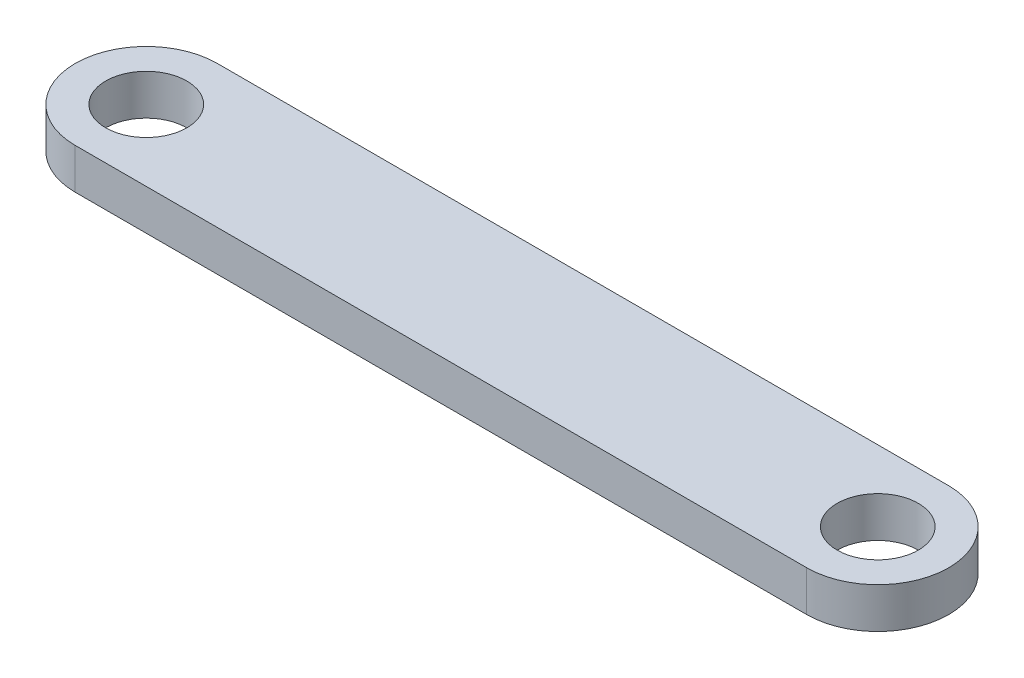
ISO-10303-21;
HEADER;
FILE_DESCRIPTION(('STEP AP214'),'2;1');
FILE_NAME('part.step','',(''),(''),'','','');
FILE_SCHEMA(('AUTOMOTIVE_DESIGN { 1 0 10303 214 1 1 1 1 }'));
ENDSEC;
DATA;
#1=APPLICATION_CONTEXT('core data for automotive mechanical design processes');
#2=APPLICATION_PROTOCOL_DEFINITION('international standard','automotive_design',2000,#1);
#3=PRODUCT_CONTEXT('',#1,'mechanical');
#4=PRODUCT('Part','Part','',(#3));
#5=PRODUCT_RELATED_PRODUCT_CATEGORY('part','',(#4));
#6=PRODUCT_DEFINITION_FORMATION('','',#4);
#7=PRODUCT_DEFINITION_CONTEXT('part definition',#1,'design');
#8=PRODUCT_DEFINITION('design','',#6,#7);
#9=PRODUCT_DEFINITION_SHAPE('','',#8);
#10=(LENGTH_UNIT() NAMED_UNIT(*) SI_UNIT(.MILLI.,.METRE.));
#11=(NAMED_UNIT(*) PLANE_ANGLE_UNIT() SI_UNIT($,.RADIAN.));
#12=(NAMED_UNIT(*) SI_UNIT($,.STERADIAN.) SOLID_ANGLE_UNIT());
#13=UNCERTAINTY_MEASURE_WITH_UNIT(LENGTH_MEASURE(1.E-05),#10,'distance_accuracy_value','');
#14=(GEOMETRIC_REPRESENTATION_CONTEXT(3) GLOBAL_UNCERTAINTY_ASSIGNED_CONTEXT((#13)) GLOBAL_UNIT_ASSIGNED_CONTEXT((#10,
#11,#12)) REPRESENTATION_CONTEXT('',''));
#15=CARTESIAN_POINT('',(0.,0.,0.));
#16=DIRECTION('',(0.,0.,1.));
#17=DIRECTION('',(1.,0.,0.));
#18=AXIS2_PLACEMENT_3D('',#15,#16,#17);
#19=CARTESIAN_POINT('',(0.,2.,-2.96135286756064));
#20=DIRECTION('',(0.,0.,-1.));
#21=DIRECTION('',(-1.,0.,0.));
#22=AXIS2_PLACEMENT_3D('',#19,#20,#21);
#23=PLANE('',#22);
#24=DIRECTION('',(1.,0.,0.));
#25=VECTOR('',#24,1.);
#26=CARTESIAN_POINT('',(0.,0.,-2.96135286756064));
#27=LINE('',#26,#25);
#28=CARTESIAN_POINT('',(-26.6606719601431,0.,-2.96135286756064));
#29=VERTEX_POINT('',#28);
#30=CARTESIAN_POINT('',(9.38932803985693,0.,-2.96135286756064));
#31=VERTEX_POINT('',#30);
#32=EDGE_CURVE('E104',#29,#31,#27,.T.);
#33=ORIENTED_EDGE('',*,*,#32,.T.);
#34=DIRECTION('',(0.,-1.,0.));
#35=VECTOR('',#34,1.);
#36=CARTESIAN_POINT('',(9.38932803985693,2.,-2.96135286756064));
#37=LINE('',#36,#35);
#38=CARTESIAN_POINT('',(9.38932803985693,2.,-2.96135286756064));
#39=VERTEX_POINT('',#38);
#40=EDGE_CURVE('E11',#39,#31,#37,.T.);
#41=ORIENTED_EDGE('',*,*,#40,.F.);
#42=DIRECTION('',(1.,0.,0.));
#43=VECTOR('',#42,1.);
#44=CARTESIAN_POINT('',(0.,2.,-2.96135286756064));
#45=LINE('',#44,#43);
#46=CARTESIAN_POINT('',(-26.6606719601431,2.,-2.96135286756064));
#47=VERTEX_POINT('',#46);
#48=EDGE_CURVE('E83',#47,#39,#45,.T.);
#49=ORIENTED_EDGE('',*,*,#48,.F.);
#50=DIRECTION('',(0.,-1.,0.));
#51=VECTOR('',#50,1.);
#52=CARTESIAN_POINT('',(-26.6606719601431,2.,-2.96135286756064));
#53=LINE('',#52,#51);
#54=EDGE_CURVE('E94',#47,#29,#53,.T.);
#55=ORIENTED_EDGE('',*,*,#54,.T.);
#56=EDGE_LOOP('',(#33,#41,#49,#55));
#57=FACE_BOUND('',#56,.T.);
#58=ADVANCED_FACE('F35',(#57),#23,.F.);
#59=CARTESIAN_POINT('',(9.38932803985693,2.,-6.46135286756064));
#60=DIRECTION('',(0.,-1.,0.));
#61=DIRECTION('',(0.,0.,-1.));
#62=AXIS2_PLACEMENT_3D('',#59,#60,#61);
#63=CYLINDRICAL_SURFACE('',#62,3.5);
#64=CARTESIAN_POINT('',(9.38932803985693,0.,-6.46135286756064));
#65=DIRECTION('',(0.,1.,0.));
#66=DIRECTION('',(0.,0.,1.));
#67=AXIS2_PLACEMENT_3D('',#64,#65,#66);
#68=CIRCLE('',#67,3.5);
#69=CARTESIAN_POINT('',(9.38932803985693,0.,-9.96135286756064));
#70=VERTEX_POINT('',#69);
#71=EDGE_CURVE('E88',#31,#70,#68,.T.);
#72=ORIENTED_EDGE('',*,*,#71,.T.);
#73=DIRECTION('',(0.,-1.,0.));
#74=VECTOR('',#73,1.);
#75=CARTESIAN_POINT('',(9.38932803985693,2.,-9.96135286756064));
#76=LINE('',#75,#74);
#77=CARTESIAN_POINT('',(9.38932803985693,2.,-9.96135286756064));
#78=VERTEX_POINT('',#77);
#79=EDGE_CURVE('E44',#78,#70,#76,.T.);
#80=ORIENTED_EDGE('',*,*,#79,.F.);
#81=CARTESIAN_POINT('',(9.38932803985693,2.,-6.46135286756064));
#82=DIRECTION('',(0.,1.,0.));
#83=DIRECTION('',(0.,0.,1.));
#84=AXIS2_PLACEMENT_3D('',#81,#82,#83);
#85=CIRCLE('',#84,3.5);
#86=EDGE_CURVE('E78',#39,#78,#85,.T.);
#87=ORIENTED_EDGE('',*,*,#86,.F.);
#88=ORIENTED_EDGE('',*,*,#40,.T.);
#89=EDGE_LOOP('',(#72,#80,#87,#88));
#90=FACE_BOUND('',#89,.T.);
#91=ADVANCED_FACE('F87',(#90),#63,.T.);
#92=CARTESIAN_POINT('',(0.,2.,-9.96135286756064));
#93=DIRECTION('',(0.,0.,-1.));
#94=DIRECTION('',(-1.,0.,0.));
#95=AXIS2_PLACEMENT_3D('',#92,#93,#94);
#96=PLANE('',#95);
#97=DIRECTION('',(1.,0.,0.));
#98=VECTOR('',#97,1.);
#99=CARTESIAN_POINT('',(0.,0.,-9.96135286756064));
#100=LINE('',#99,#98);
#101=CARTESIAN_POINT('',(-26.6606719601431,0.,-9.96135286756064));
#102=VERTEX_POINT('',#101);
#103=EDGE_CURVE('E108',#102,#70,#100,.T.);
#104=ORIENTED_EDGE('',*,*,#103,.F.);
#105=DIRECTION('',(0.,-1.,0.));
#106=VECTOR('',#105,1.);
#107=CARTESIAN_POINT('',(-26.6606719601431,2.,-9.96135286756064));
#108=LINE('',#107,#106);
#109=CARTESIAN_POINT('',(-26.6606719601431,2.,-9.96135286756064));
#110=VERTEX_POINT('',#109);
#111=EDGE_CURVE('E68',#110,#102,#108,.T.);
#112=ORIENTED_EDGE('',*,*,#111,.F.);
#113=DIRECTION('',(1.,0.,0.));
#114=VECTOR('',#113,1.);
#115=CARTESIAN_POINT('',(0.,2.,-9.96135286756064));
#116=LINE('',#115,#114);
#117=EDGE_CURVE('E81',#110,#78,#116,.T.);
#118=ORIENTED_EDGE('',*,*,#117,.T.);
#119=ORIENTED_EDGE('',*,*,#79,.T.);
#120=EDGE_LOOP('',(#104,#112,#118,#119));
#121=FACE_BOUND('',#120,.T.);
#122=ADVANCED_FACE('F92',(#121),#96,.T.);
#123=CARTESIAN_POINT('',(9.38932803985693,2.,-6.46135286756064));
#124=DIRECTION('',(0.,-1.,0.));
#125=DIRECTION('',(0.,0.,-1.));
#126=AXIS2_PLACEMENT_3D('',#123,#124,#125);
#127=CYLINDRICAL_SURFACE('',#126,2.);
#128=CARTESIAN_POINT('',(9.38932803985693,2.,-6.46135286756064));
#129=DIRECTION('',(0.,1.,0.));
#130=DIRECTION('',(0.,0.,1.));
#131=AXIS2_PLACEMENT_3D('',#128,#129,#130);
#132=CIRCLE('',#131,2.);
#133=CARTESIAN_POINT('',(9.38932803985693,2.,-4.46135286756064));
#134=VERTEX_POINT('',#133);
#135=EDGE_CURVE('E146',#134,#134,#132,.T.);
#136=ORIENTED_EDGE('',*,*,#135,.T.);
#137=EDGE_LOOP('',(#136));
#138=FACE_BOUND('',#137,.T.);
#139=CARTESIAN_POINT('',(9.38932803985693,0.,-6.46135286756064));
#140=DIRECTION('',(0.,1.,0.));
#141=DIRECTION('',(0.,0.,1.));
#142=AXIS2_PLACEMENT_3D('',#139,#140,#141);
#143=CIRCLE('',#142,2.);
#144=CARTESIAN_POINT('',(9.38932803985693,0.,-4.46135286756064));
#145=VERTEX_POINT('',#144);
#146=EDGE_CURVE('E101',#145,#145,#143,.T.);
#147=ORIENTED_EDGE('',*,*,#146,.F.);
#148=EDGE_LOOP('',(#147));
#149=FACE_BOUND('',#148,.T.);
#150=ADVANCED_FACE('F135',(#138,#149),#127,.F.);
#151=CARTESIAN_POINT('',(-26.6606719601431,2.,-6.46135286756064));
#152=DIRECTION('',(0.,-1.,0.));
#153=DIRECTION('',(0.,0.,-1.));
#154=AXIS2_PLACEMENT_3D('',#151,#152,#153);
#155=CYLINDRICAL_SURFACE('',#154,2.);
#156=CARTESIAN_POINT('',(-26.6606719601431,2.,-6.46135286756064));
#157=DIRECTION('',(0.,1.,0.));
#158=DIRECTION('',(0.,0.,1.));
#159=AXIS2_PLACEMENT_3D('',#156,#157,#158);
#160=CIRCLE('',#159,2.);
#161=CARTESIAN_POINT('',(-26.6606719601431,2.,-4.46135286756063));
#162=VERTEX_POINT('',#161);
#163=EDGE_CURVE('E111',#162,#162,#160,.T.);
#164=ORIENTED_EDGE('',*,*,#163,.T.);
#165=EDGE_LOOP('',(#164));
#166=FACE_BOUND('',#165,.T.);
#167=CARTESIAN_POINT('',(-26.6606719601431,0.,-6.46135286756064));
#168=DIRECTION('',(0.,1.,0.));
#169=DIRECTION('',(0.,0.,1.));
#170=AXIS2_PLACEMENT_3D('',#167,#168,#169);
#171=CIRCLE('',#170,2.);
#172=CARTESIAN_POINT('',(-26.6606719601431,0.,-4.46135286756063));
#173=VERTEX_POINT('',#172);
#174=EDGE_CURVE('E98',#173,#173,#171,.T.);
#175=ORIENTED_EDGE('',*,*,#174,.F.);
#176=EDGE_LOOP('',(#175));
#177=FACE_BOUND('',#176,.T.);
#178=ADVANCED_FACE('F37',(#166,#177),#155,.F.);
#179=CARTESIAN_POINT('',(-26.6606719601431,2.,-6.46135286756064));
#180=DIRECTION('',(0.,-1.,0.));
#181=DIRECTION('',(0.,0.,-1.));
#182=AXIS2_PLACEMENT_3D('',#179,#180,#181);
#183=CYLINDRICAL_SURFACE('',#182,3.5);
#184=CARTESIAN_POINT('',(-26.6606719601431,0.,-6.46135286756064));
#185=DIRECTION('',(0.,1.,0.));
#186=DIRECTION('',(0.,0.,1.));
#187=AXIS2_PLACEMENT_3D('',#184,#185,#186);
#188=CIRCLE('',#187,3.5);
#189=EDGE_CURVE('E71',#102,#29,#188,.T.);
#190=ORIENTED_EDGE('',*,*,#189,.T.);
#191=ORIENTED_EDGE('',*,*,#54,.F.);
#192=CARTESIAN_POINT('',(-26.6606719601431,2.,-6.46135286756064));
#193=DIRECTION('',(0.,1.,0.));
#194=DIRECTION('',(0.,0.,1.));
#195=AXIS2_PLACEMENT_3D('',#192,#193,#194);
#196=CIRCLE('',#195,3.5);
#197=EDGE_CURVE('E52',#110,#47,#196,.T.);
#198=ORIENTED_EDGE('',*,*,#197,.F.);
#199=ORIENTED_EDGE('',*,*,#111,.T.);
#200=EDGE_LOOP('',(#190,#191,#198,#199));
#201=FACE_BOUND('',#200,.T.);
#202=ADVANCED_FACE('F123',(#201),#183,.T.);
#203=CARTESIAN_POINT('',(0.,2.,0.));
#204=DIRECTION('',(0.,1.,0.));
#205=DIRECTION('',(0.,0.,1.));
#206=AXIS2_PLACEMENT_3D('',#203,#204,#205);
#207=PLANE('',#206);
#208=ORIENTED_EDGE('',*,*,#163,.F.);
#209=EDGE_LOOP('',(#208));
#210=FACE_BOUND('',#209,.T.);
#211=ORIENTED_EDGE('',*,*,#135,.F.);
#212=EDGE_LOOP('',(#211));
#213=FACE_BOUND('',#212,.T.);
#214=ORIENTED_EDGE('',*,*,#48,.T.);
#215=ORIENTED_EDGE('',*,*,#86,.T.);
#216=ORIENTED_EDGE('',*,*,#117,.F.);
#217=ORIENTED_EDGE('',*,*,#197,.T.);
#218=EDGE_LOOP('',(#214,#215,#216,#217));
#219=FACE_BOUND('',#218,.T.);
#220=ADVANCED_FACE('F79',(#210,#213,#219),#207,.T.);
#221=CARTESIAN_POINT('',(0.,0.,0.));
#222=DIRECTION('',(0.,1.,0.));
#223=DIRECTION('',(0.,0.,1.));
#224=AXIS2_PLACEMENT_3D('',#221,#222,#223);
#225=PLANE('',#224);
#226=ORIENTED_EDGE('',*,*,#174,.T.);
#227=EDGE_LOOP('',(#226));
#228=FACE_BOUND('',#227,.T.);
#229=ORIENTED_EDGE('',*,*,#146,.T.);
#230=EDGE_LOOP('',(#229));
#231=FACE_BOUND('',#230,.T.);
#232=ORIENTED_EDGE('',*,*,#32,.F.);
#233=ORIENTED_EDGE('',*,*,#189,.F.);
#234=ORIENTED_EDGE('',*,*,#103,.T.);
#235=ORIENTED_EDGE('',*,*,#71,.F.);
#236=EDGE_LOOP('',(#232,#233,#234,#235));
#237=FACE_BOUND('',#236,.T.);
#238=ADVANCED_FACE('F116',(#228,#231,#237),#225,.F.);
#239=CLOSED_SHELL('',(#58,#91,#122,#150,#178,#202,#220,#238));
#240=MANIFOLD_SOLID_BREP('B2',#239);
#241=ADVANCED_BREP_SHAPE_REPRESENTATION('',(#18,#240),#14);
#242=SHAPE_DEFINITION_REPRESENTATION(#9,#241);
ENDSEC;
END-ISO-10303-21;
